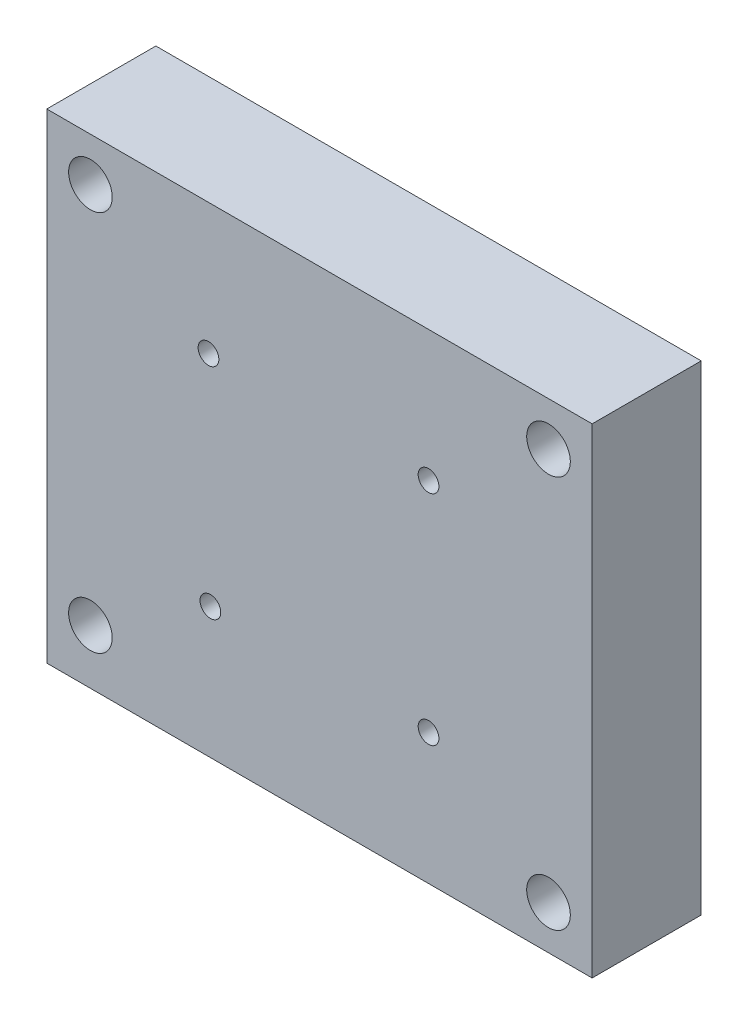
ISO-10303-21;
HEADER;
FILE_DESCRIPTION(('STEP AP214'),'2;1');
FILE_NAME('part.step','',(''),(''),'','','');
FILE_SCHEMA(('AUTOMOTIVE_DESIGN { 1 0 10303 214 1 1 1 1 }'));
ENDSEC;
DATA;
#1=APPLICATION_CONTEXT('core data for automotive mechanical design processes');
#2=APPLICATION_PROTOCOL_DEFINITION('international standard','automotive_design',2000,#1);
#3=PRODUCT_CONTEXT('',#1,'mechanical');
#4=PRODUCT('Part','Part','',(#3));
#5=PRODUCT_RELATED_PRODUCT_CATEGORY('part','',(#4));
#6=PRODUCT_DEFINITION_FORMATION('','',#4);
#7=PRODUCT_DEFINITION_CONTEXT('part definition',#1,'design');
#8=PRODUCT_DEFINITION('design','',#6,#7);
#9=PRODUCT_DEFINITION_SHAPE('','',#8);
#10=(LENGTH_UNIT() NAMED_UNIT(*) SI_UNIT(.MILLI.,.METRE.));
#11=(NAMED_UNIT(*) PLANE_ANGLE_UNIT() SI_UNIT($,.RADIAN.));
#12=(NAMED_UNIT(*) SI_UNIT($,.STERADIAN.) SOLID_ANGLE_UNIT());
#13=UNCERTAINTY_MEASURE_WITH_UNIT(LENGTH_MEASURE(1.E-05),#10,'distance_accuracy_value','');
#14=(GEOMETRIC_REPRESENTATION_CONTEXT(3) GLOBAL_UNCERTAINTY_ASSIGNED_CONTEXT((#13)) GLOBAL_UNIT_ASSIGNED_CONTEXT((#10,
#11,#12)) REPRESENTATION_CONTEXT('',''));
#15=CARTESIAN_POINT('',(0.,0.,0.));
#16=DIRECTION('',(0.,0.,1.));
#17=DIRECTION('',(1.,0.,0.));
#18=AXIS2_PLACEMENT_3D('',#15,#16,#17);
#19=CARTESIAN_POINT('',(25.,-6.,0.));
#20=DIRECTION('',(0.,0.,-1.));
#21=DIRECTION('',(-1.,0.,0.));
#22=AXIS2_PLACEMENT_3D('',#19,#20,#21);
#23=PLANE('',#22);
#24=CARTESIAN_POINT('',(2.,14.,0.));
#25=DIRECTION('',(0.,0.,1.));
#26=DIRECTION('',(1.,0.,0.));
#27=AXIS2_PLACEMENT_3D('',#24,#25,#26);
#28=CIRCLE('',#27,0.999999999999987);
#29=CARTESIAN_POINT('',(2.99999999999999,14.,0.));
#30=VERTEX_POINT('',#29);
#31=EDGE_CURVE('E175',#30,#30,#28,.T.);
#32=ORIENTED_EDGE('',*,*,#31,.F.);
#33=EDGE_LOOP('',(#32));
#34=FACE_BOUND('',#33,.T.);
#35=CARTESIAN_POINT('',(2.,-3.5,0.));
#36=DIRECTION('',(0.,0.,1.));
#37=DIRECTION('',(1.,0.,0.));
#38=AXIS2_PLACEMENT_3D('',#35,#36,#37);
#39=CIRCLE('',#38,0.999999999999987);
#40=CARTESIAN_POINT('',(2.99999999999999,-3.5,0.));
#41=VERTEX_POINT('',#40);
#42=EDGE_CURVE('E169',#41,#41,#39,.T.);
#43=ORIENTED_EDGE('',*,*,#42,.F.);
#44=EDGE_LOOP('',(#43));
#45=FACE_BOUND('',#44,.T.);
#46=CARTESIAN_POINT('',(23.,-4.,0.));
#47=DIRECTION('',(0.,0.,1.));
#48=DIRECTION('',(1.,0.,0.));
#49=AXIS2_PLACEMENT_3D('',#46,#47,#48);
#50=CIRCLE('',#49,0.999999999999987);
#51=CARTESIAN_POINT('',(24.,-4.,0.));
#52=VERTEX_POINT('',#51);
#53=EDGE_CURVE('E163',#52,#52,#50,.T.);
#54=ORIENTED_EDGE('',*,*,#53,.F.);
#55=EDGE_LOOP('',(#54));
#56=FACE_BOUND('',#55,.T.);
#57=CARTESIAN_POINT('',(23.,14.,0.));
#58=DIRECTION('',(0.,0.,1.));
#59=DIRECTION('',(1.,0.,0.));
#60=AXIS2_PLACEMENT_3D('',#57,#58,#59);
#61=CIRCLE('',#60,0.999999999999987);
#62=CARTESIAN_POINT('',(24.,14.,0.));
#63=VERTEX_POINT('',#62);
#64=EDGE_CURVE('E157',#63,#63,#61,.T.);
#65=ORIENTED_EDGE('',*,*,#64,.F.);
#66=EDGE_LOOP('',(#65));
#67=FACE_BOUND('',#66,.T.);
#68=CARTESIAN_POINT('',(17.5,10.,0.));
#69=DIRECTION('',(0.,0.,-1.));
#70=DIRECTION('',(0.,1.,0.));
#71=AXIS2_PLACEMENT_3D('',#68,#69,#70);
#72=CIRCLE('',#71,0.475);
#73=CARTESIAN_POINT('',(17.5,10.475,0.));
#74=VERTEX_POINT('',#73);
#75=EDGE_CURVE('E148',#74,#74,#72,.T.);
#76=ORIENTED_EDGE('',*,*,#75,.T.);
#77=EDGE_LOOP('',(#76));
#78=FACE_BOUND('',#77,.T.);
#79=CARTESIAN_POINT('',(7.41313290791594,10.,0.));
#80=DIRECTION('',(0.,0.,-1.));
#81=DIRECTION('',(0.,1.,0.));
#82=AXIS2_PLACEMENT_3D('',#79,#80,#81);
#83=CIRCLE('',#82,0.475);
#84=CARTESIAN_POINT('',(7.41313290791594,10.475,0.));
#85=VERTEX_POINT('',#84);
#86=EDGE_CURVE('E142',#85,#85,#83,.T.);
#87=ORIENTED_EDGE('',*,*,#86,.T.);
#88=EDGE_LOOP('',(#87));
#89=FACE_BOUND('',#88,.T.);
#90=CARTESIAN_POINT('',(17.5,0.,0.));
#91=DIRECTION('',(0.,0.,-1.));
#92=DIRECTION('',(0.,1.,0.));
#93=AXIS2_PLACEMENT_3D('',#90,#91,#92);
#94=CIRCLE('',#93,0.475);
#95=CARTESIAN_POINT('',(17.5,0.475000000000001,0.));
#96=VERTEX_POINT('',#95);
#97=EDGE_CURVE('E136',#96,#96,#94,.T.);
#98=ORIENTED_EDGE('',*,*,#97,.T.);
#99=EDGE_LOOP('',(#98));
#100=FACE_BOUND('',#99,.T.);
#101=CARTESIAN_POINT('',(7.5,0.,0.));
#102=DIRECTION('',(0.,0.,-1.));
#103=DIRECTION('',(0.,1.,0.));
#104=AXIS2_PLACEMENT_3D('',#101,#102,#103);
#105=CIRCLE('',#104,0.475);
#106=CARTESIAN_POINT('',(7.5,0.475000000000001,0.));
#107=VERTEX_POINT('',#106);
#108=EDGE_CURVE('E130',#107,#107,#105,.T.);
#109=ORIENTED_EDGE('',*,*,#108,.T.);
#110=EDGE_LOOP('',(#109));
#111=FACE_BOUND('',#110,.T.);
#112=DIRECTION('',(0.,-1.,0.));
#113=VECTOR('',#112,1.);
#114=CARTESIAN_POINT('',(0.,-6.,0.));
#115=LINE('',#114,#113);
#116=CARTESIAN_POINT('',(0.,16.,0.));
#117=VERTEX_POINT('',#116);
#118=CARTESIAN_POINT('',(0.,-6.,0.));
#119=VERTEX_POINT('',#118);
#120=EDGE_CURVE('E99',#117,#119,#115,.T.);
#121=ORIENTED_EDGE('',*,*,#120,.T.);
#122=DIRECTION('',(-1.,0.,0.));
#123=VECTOR('',#122,1.);
#124=CARTESIAN_POINT('',(25.,-6.,0.));
#125=LINE('',#124,#123);
#126=CARTESIAN_POINT('',(25.,-6.,0.));
#127=VERTEX_POINT('',#126);
#128=EDGE_CURVE('E11',#127,#119,#125,.T.);
#129=ORIENTED_EDGE('',*,*,#128,.F.);
#130=DIRECTION('',(0.,-1.,0.));
#131=VECTOR('',#130,1.);
#132=CARTESIAN_POINT('',(25.,-6.,0.));
#133=LINE('',#132,#131);
#134=CARTESIAN_POINT('',(25.,16.,0.));
#135=VERTEX_POINT('',#134);
#136=EDGE_CURVE('E87',#135,#127,#133,.T.);
#137=ORIENTED_EDGE('',*,*,#136,.F.);
#138=DIRECTION('',(-1.,0.,0.));
#139=VECTOR('',#138,1.);
#140=CARTESIAN_POINT('',(25.,16.,0.));
#141=LINE('',#140,#139);
#142=EDGE_CURVE('E95',#135,#117,#141,.T.);
#143=ORIENTED_EDGE('',*,*,#142,.T.);
#144=EDGE_LOOP('',(#121,#129,#137,#143));
#145=FACE_BOUND('',#144,.T.);
#146=ADVANCED_FACE('F36',(#34,#45,#56,#67,#78,#89,#100,#111,#145),#23,.F.);
#147=CARTESIAN_POINT('',(25.,-6.,0.));
#148=DIRECTION('',(0.,1.,0.));
#149=DIRECTION('',(0.,0.,1.));
#150=AXIS2_PLACEMENT_3D('',#147,#148,#149);
#151=PLANE('',#150);
#152=CARTESIAN_POINT('',(19.5,-6.,-2.5));
#153=DIRECTION('',(0.,-1.,0.));
#154=DIRECTION('',(0.,0.,-1.));
#155=AXIS2_PLACEMENT_3D('',#152,#153,#154);
#156=CIRCLE('',#155,1.25);
#157=CARTESIAN_POINT('',(19.5,-6.,-3.75));
#158=VERTEX_POINT('',#157);
#159=EDGE_CURVE('E127',#158,#158,#156,.T.);
#160=ORIENTED_EDGE('',*,*,#159,.F.);
#161=EDGE_LOOP('',(#160));
#162=FACE_BOUND('',#161,.T.);
#163=CARTESIAN_POINT('',(12.5,-6.,-2.5));
#164=DIRECTION('',(0.,-1.,0.));
#165=DIRECTION('',(0.,0.,-1.));
#166=AXIS2_PLACEMENT_3D('',#163,#164,#165);
#167=CIRCLE('',#166,1.25);
#168=CARTESIAN_POINT('',(12.5,-6.,-3.75));
#169=VERTEX_POINT('',#168);
#170=EDGE_CURVE('E121',#169,#169,#167,.T.);
#171=ORIENTED_EDGE('',*,*,#170,.F.);
#172=EDGE_LOOP('',(#171));
#173=FACE_BOUND('',#172,.T.);
#174=CARTESIAN_POINT('',(5.5,-6.,-2.5));
#175=DIRECTION('',(0.,-1.,0.));
#176=DIRECTION('',(0.,0.,-1.));
#177=AXIS2_PLACEMENT_3D('',#174,#175,#176);
#178=CIRCLE('',#177,1.25);
#179=CARTESIAN_POINT('',(5.5,-6.,-3.75));
#180=VERTEX_POINT('',#179);
#181=EDGE_CURVE('E115',#180,#180,#178,.T.);
#182=ORIENTED_EDGE('',*,*,#181,.F.);
#183=EDGE_LOOP('',(#182));
#184=FACE_BOUND('',#183,.T.);
#185=DIRECTION('',(0.,0.,-1.));
#186=VECTOR('',#185,1.);
#187=CARTESIAN_POINT('',(0.,-6.,0.));
#188=LINE('',#187,#186);
#189=CARTESIAN_POINT('',(0.,-6.,-5.));
#190=VERTEX_POINT('',#189);
#191=EDGE_CURVE('E91',#119,#190,#188,.T.);
#192=ORIENTED_EDGE('',*,*,#191,.T.);
#193=DIRECTION('',(-1.,0.,0.));
#194=VECTOR('',#193,1.);
#195=CARTESIAN_POINT('',(25.,-6.,-5.));
#196=LINE('',#195,#194);
#197=CARTESIAN_POINT('',(25.,-6.,-5.));
#198=VERTEX_POINT('',#197);
#199=EDGE_CURVE('E44',#198,#190,#196,.T.);
#200=ORIENTED_EDGE('',*,*,#199,.F.);
#201=DIRECTION('',(0.,0.,-1.));
#202=VECTOR('',#201,1.);
#203=CARTESIAN_POINT('',(25.,-6.,0.));
#204=LINE('',#203,#202);
#205=EDGE_CURVE('E82',#127,#198,#204,.T.);
#206=ORIENTED_EDGE('',*,*,#205,.F.);
#207=ORIENTED_EDGE('',*,*,#128,.T.);
#208=EDGE_LOOP('',(#192,#200,#206,#207));
#209=FACE_BOUND('',#208,.T.);
#210=ADVANCED_FACE('F90',(#162,#173,#184,#209),#151,.F.);
#211=CARTESIAN_POINT('',(25.,16.,-5.));
#212=DIRECTION('',(0.,0.,1.));
#213=DIRECTION('',(0.,-1.,0.));
#214=AXIS2_PLACEMENT_3D('',#211,#212,#213);
#215=PLANE('',#214);
#216=CARTESIAN_POINT('',(2.,14.,-5.));
#217=DIRECTION('',(0.,0.,1.));
#218=DIRECTION('',(1.,0.,0.));
#219=AXIS2_PLACEMENT_3D('',#216,#217,#218);
#220=CIRCLE('',#219,0.999999999999999);
#221=CARTESIAN_POINT('',(3.,14.,-5.));
#222=VERTEX_POINT('',#221);
#223=EDGE_CURVE('E172',#222,#222,#220,.T.);
#224=ORIENTED_EDGE('',*,*,#223,.T.);
#225=EDGE_LOOP('',(#224));
#226=FACE_BOUND('',#225,.T.);
#227=CARTESIAN_POINT('',(2.,-3.5,-5.));
#228=DIRECTION('',(0.,0.,1.));
#229=DIRECTION('',(1.,0.,0.));
#230=AXIS2_PLACEMENT_3D('',#227,#228,#229);
#231=CIRCLE('',#230,0.999999999999999);
#232=CARTESIAN_POINT('',(3.,-3.5,-5.));
#233=VERTEX_POINT('',#232);
#234=EDGE_CURVE('E166',#233,#233,#231,.T.);
#235=ORIENTED_EDGE('',*,*,#234,.T.);
#236=EDGE_LOOP('',(#235));
#237=FACE_BOUND('',#236,.T.);
#238=CARTESIAN_POINT('',(23.,-4.,-5.));
#239=DIRECTION('',(0.,0.,1.));
#240=DIRECTION('',(1.,0.,0.));
#241=AXIS2_PLACEMENT_3D('',#238,#239,#240);
#242=CIRCLE('',#241,0.999999999999997);
#243=CARTESIAN_POINT('',(24.,-4.,-5.));
#244=VERTEX_POINT('',#243);
#245=EDGE_CURVE('E160',#244,#244,#242,.T.);
#246=ORIENTED_EDGE('',*,*,#245,.T.);
#247=EDGE_LOOP('',(#246));
#248=FACE_BOUND('',#247,.T.);
#249=CARTESIAN_POINT('',(23.,14.,-5.));
#250=DIRECTION('',(0.,0.,1.));
#251=DIRECTION('',(1.,0.,0.));
#252=AXIS2_PLACEMENT_3D('',#249,#250,#251);
#253=CIRCLE('',#252,0.999999999999997);
#254=CARTESIAN_POINT('',(24.,14.,-5.));
#255=VERTEX_POINT('',#254);
#256=EDGE_CURVE('E154',#255,#255,#253,.T.);
#257=ORIENTED_EDGE('',*,*,#256,.T.);
#258=EDGE_LOOP('',(#257));
#259=FACE_BOUND('',#258,.T.);
#260=CARTESIAN_POINT('',(17.5,10.,-5.));
#261=DIRECTION('',(0.,0.,-1.));
#262=DIRECTION('',(0.,1.,0.));
#263=AXIS2_PLACEMENT_3D('',#260,#261,#262);
#264=CIRCLE('',#263,0.475);
#265=CARTESIAN_POINT('',(17.5,10.475,-5.));
#266=VERTEX_POINT('',#265);
#267=EDGE_CURVE('E151',#266,#266,#264,.T.);
#268=ORIENTED_EDGE('',*,*,#267,.F.);
#269=EDGE_LOOP('',(#268));
#270=FACE_BOUND('',#269,.T.);
#271=CARTESIAN_POINT('',(7.41313290791594,10.,-5.));
#272=DIRECTION('',(0.,0.,-1.));
#273=DIRECTION('',(0.,1.,0.));
#274=AXIS2_PLACEMENT_3D('',#271,#272,#273);
#275=CIRCLE('',#274,0.475);
#276=CARTESIAN_POINT('',(7.41313290791594,10.475,-5.));
#277=VERTEX_POINT('',#276);
#278=EDGE_CURVE('E145',#277,#277,#275,.T.);
#279=ORIENTED_EDGE('',*,*,#278,.F.);
#280=EDGE_LOOP('',(#279));
#281=FACE_BOUND('',#280,.T.);
#282=CARTESIAN_POINT('',(17.5,0.,-5.));
#283=DIRECTION('',(0.,0.,-1.));
#284=DIRECTION('',(0.,1.,0.));
#285=AXIS2_PLACEMENT_3D('',#282,#283,#284);
#286=CIRCLE('',#285,0.475);
#287=CARTESIAN_POINT('',(17.5,0.475000000000001,-5.));
#288=VERTEX_POINT('',#287);
#289=EDGE_CURVE('E139',#288,#288,#286,.T.);
#290=ORIENTED_EDGE('',*,*,#289,.F.);
#291=EDGE_LOOP('',(#290));
#292=FACE_BOUND('',#291,.T.);
#293=CARTESIAN_POINT('',(7.5,0.,-5.));
#294=DIRECTION('',(0.,0.,-1.));
#295=DIRECTION('',(0.,1.,0.));
#296=AXIS2_PLACEMENT_3D('',#293,#294,#295);
#297=CIRCLE('',#296,0.475);
#298=CARTESIAN_POINT('',(7.5,0.475000000000001,-5.));
#299=VERTEX_POINT('',#298);
#300=EDGE_CURVE('E133',#299,#299,#297,.T.);
#301=ORIENTED_EDGE('',*,*,#300,.F.);
#302=EDGE_LOOP('',(#301));
#303=FACE_BOUND('',#302,.T.);
#304=DIRECTION('',(0.,1.,0.));
#305=VECTOR('',#304,1.);
#306=CARTESIAN_POINT('',(0.,16.,-5.));
#307=LINE('',#306,#305);
#308=CARTESIAN_POINT('',(0.,16.,-5.));
#309=VERTEX_POINT('',#308);
#310=EDGE_CURVE('E69',#190,#309,#307,.T.);
#311=ORIENTED_EDGE('',*,*,#310,.T.);
#312=DIRECTION('',(-1.,0.,0.));
#313=VECTOR('',#312,1.);
#314=CARTESIAN_POINT('',(25.,16.,-5.));
#315=LINE('',#314,#313);
#316=CARTESIAN_POINT('',(25.,16.,-5.));
#317=VERTEX_POINT('',#316);
#318=EDGE_CURVE('E92',#317,#309,#315,.T.);
#319=ORIENTED_EDGE('',*,*,#318,.F.);
#320=DIRECTION('',(0.,1.,0.));
#321=VECTOR('',#320,1.);
#322=CARTESIAN_POINT('',(25.,16.,-5.));
#323=LINE('',#322,#321);
#324=EDGE_CURVE('E85',#198,#317,#323,.T.);
#325=ORIENTED_EDGE('',*,*,#324,.F.);
#326=ORIENTED_EDGE('',*,*,#199,.T.);
#327=EDGE_LOOP('',(#311,#319,#325,#326));
#328=FACE_BOUND('',#327,.T.);
#329=ADVANCED_FACE('F93',(#226,#237,#248,#259,#270,#281,#292,#303,#328),#215,.F.);
#330=CARTESIAN_POINT('',(25.,16.,0.));
#331=DIRECTION('',(0.,-1.,0.));
#332=DIRECTION('',(0.,0.,-1.));
#333=AXIS2_PLACEMENT_3D('',#330,#331,#332);
#334=PLANE('',#333);
#335=DIRECTION('',(0.,0.,1.));
#336=VECTOR('',#335,1.);
#337=CARTESIAN_POINT('',(0.,16.,0.));
#338=LINE('',#337,#336);
#339=EDGE_CURVE('E75',#309,#117,#338,.T.);
#340=ORIENTED_EDGE('',*,*,#339,.T.);
#341=ORIENTED_EDGE('',*,*,#142,.F.);
#342=DIRECTION('',(0.,0.,1.));
#343=VECTOR('',#342,1.);
#344=CARTESIAN_POINT('',(25.,16.,0.));
#345=LINE('',#344,#343);
#346=EDGE_CURVE('E52',#317,#135,#345,.T.);
#347=ORIENTED_EDGE('',*,*,#346,.F.);
#348=ORIENTED_EDGE('',*,*,#318,.T.);
#349=EDGE_LOOP('',(#340,#341,#347,#348));
#350=FACE_BOUND('',#349,.T.);
#351=ADVANCED_FACE('F107',(#350),#334,.F.);
#352=CARTESIAN_POINT('',(25.,0.,0.));
#353=DIRECTION('',(-1.,0.,0.));
#354=DIRECTION('',(0.,0.,1.));
#355=AXIS2_PLACEMENT_3D('',#352,#353,#354);
#356=PLANE('',#355);
#357=ORIENTED_EDGE('',*,*,#136,.T.);
#358=ORIENTED_EDGE('',*,*,#205,.T.);
#359=ORIENTED_EDGE('',*,*,#324,.T.);
#360=ORIENTED_EDGE('',*,*,#346,.T.);
#361=EDGE_LOOP('',(#357,#358,#359,#360));
#362=FACE_BOUND('',#361,.T.);
#363=ADVANCED_FACE('F83',(#362),#356,.F.);
#364=CARTESIAN_POINT('',(0.,0.,0.));
#365=DIRECTION('',(-1.,0.,0.));
#366=DIRECTION('',(0.,0.,1.));
#367=AXIS2_PLACEMENT_3D('',#364,#365,#366);
#368=PLANE('',#367);
#369=ORIENTED_EDGE('',*,*,#120,.F.);
#370=ORIENTED_EDGE('',*,*,#339,.F.);
#371=ORIENTED_EDGE('',*,*,#310,.F.);
#372=ORIENTED_EDGE('',*,*,#191,.F.);
#373=EDGE_LOOP('',(#369,#370,#371,#372));
#374=FACE_BOUND('',#373,.T.);
#375=ADVANCED_FACE('F110',(#374),#368,.T.);
#376=CARTESIAN_POINT('',(5.5,-0.999999999999999,-2.5));
#377=DIRECTION('',(0.,1.,0.));
#378=DIRECTION('',(0.,0.,1.));
#379=AXIS2_PLACEMENT_3D('',#376,#377,#378);
#380=PLANE('',#379);
#381=CARTESIAN_POINT('',(5.5,-0.999999999999998,-2.5));
#382=DIRECTION('',(0.,-1.,0.));
#383=DIRECTION('',(0.,0.,-1.));
#384=AXIS2_PLACEMENT_3D('',#381,#382,#383);
#385=CIRCLE('',#384,1.25);
#386=CARTESIAN_POINT('',(5.5,-0.999999999999998,-3.75));
#387=VERTEX_POINT('',#386);
#388=EDGE_CURVE('E102',#387,#387,#385,.T.);
#389=ORIENTED_EDGE('',*,*,#388,.T.);
#390=EDGE_LOOP('',(#389));
#391=FACE_BOUND('',#390,.T.);
#392=ADVANCED_FACE('F218',(#391),#380,.F.);
#393=CARTESIAN_POINT('',(5.5,-6.,-2.5));
#394=DIRECTION('',(0.,-1.,0.));
#395=DIRECTION('',(0.,0.,-1.));
#396=AXIS2_PLACEMENT_3D('',#393,#394,#395);
#397=CYLINDRICAL_SURFACE('',#396,1.25);
#398=ORIENTED_EDGE('',*,*,#388,.F.);
#399=EDGE_LOOP('',(#398));
#400=FACE_BOUND('',#399,.T.);
#401=ORIENTED_EDGE('',*,*,#181,.T.);
#402=EDGE_LOOP('',(#401));
#403=FACE_BOUND('',#402,.T.);
#404=ADVANCED_FACE('F223',(#400,#403),#397,.F.);
#405=CARTESIAN_POINT('',(12.5,-0.999999999999999,-2.5));
#406=DIRECTION('',(0.,1.,0.));
#407=DIRECTION('',(0.,0.,1.));
#408=AXIS2_PLACEMENT_3D('',#405,#406,#407);
#409=PLANE('',#408);
#410=CARTESIAN_POINT('',(12.5,-0.999999999999998,-2.5));
#411=DIRECTION('',(0.,-1.,0.));
#412=DIRECTION('',(0.,0.,-1.));
#413=AXIS2_PLACEMENT_3D('',#410,#411,#412);
#414=CIRCLE('',#413,1.25);
#415=CARTESIAN_POINT('',(12.5,-0.999999999999998,-3.75));
#416=VERTEX_POINT('',#415);
#417=EDGE_CURVE('E118',#416,#416,#414,.T.);
#418=ORIENTED_EDGE('',*,*,#417,.T.);
#419=EDGE_LOOP('',(#418));
#420=FACE_BOUND('',#419,.T.);
#421=ADVANCED_FACE('F227',(#420),#409,.F.);
#422=CARTESIAN_POINT('',(12.5,-6.,-2.5));
#423=DIRECTION('',(0.,-1.,0.));
#424=DIRECTION('',(0.,0.,-1.));
#425=AXIS2_PLACEMENT_3D('',#422,#423,#424);
#426=CYLINDRICAL_SURFACE('',#425,1.25);
#427=ORIENTED_EDGE('',*,*,#417,.F.);
#428=EDGE_LOOP('',(#427));
#429=FACE_BOUND('',#428,.T.);
#430=ORIENTED_EDGE('',*,*,#170,.T.);
#431=EDGE_LOOP('',(#430));
#432=FACE_BOUND('',#431,.T.);
#433=ADVANCED_FACE('F231',(#429,#432),#426,.F.);
#434=CARTESIAN_POINT('',(19.5,-0.999999999999999,-2.5));
#435=DIRECTION('',(0.,1.,0.));
#436=DIRECTION('',(0.,0.,1.));
#437=AXIS2_PLACEMENT_3D('',#434,#435,#436);
#438=PLANE('',#437);
#439=CARTESIAN_POINT('',(19.5,-0.999999999999998,-2.5));
#440=DIRECTION('',(0.,-1.,0.));
#441=DIRECTION('',(0.,0.,-1.));
#442=AXIS2_PLACEMENT_3D('',#439,#440,#441);
#443=CIRCLE('',#442,1.25);
#444=CARTESIAN_POINT('',(19.5,-0.999999999999998,-3.75));
#445=VERTEX_POINT('',#444);
#446=EDGE_CURVE('E124',#445,#445,#443,.T.);
#447=ORIENTED_EDGE('',*,*,#446,.T.);
#448=EDGE_LOOP('',(#447));
#449=FACE_BOUND('',#448,.T.);
#450=ADVANCED_FACE('F235',(#449),#438,.F.);
#451=CARTESIAN_POINT('',(19.5,-6.,-2.5));
#452=DIRECTION('',(0.,-1.,0.));
#453=DIRECTION('',(0.,0.,-1.));
#454=AXIS2_PLACEMENT_3D('',#451,#452,#453);
#455=CYLINDRICAL_SURFACE('',#454,1.25);
#456=ORIENTED_EDGE('',*,*,#446,.F.);
#457=EDGE_LOOP('',(#456));
#458=FACE_BOUND('',#457,.T.);
#459=ORIENTED_EDGE('',*,*,#159,.T.);
#460=EDGE_LOOP('',(#459));
#461=FACE_BOUND('',#460,.T.);
#462=ADVANCED_FACE('F201',(#458,#461),#455,.F.);
#463=CARTESIAN_POINT('',(7.5,0.,-5.));
#464=DIRECTION('',(0.,0.,-1.));
#465=DIRECTION('',(0.,1.,0.));
#466=AXIS2_PLACEMENT_3D('',#463,#464,#465);
#467=CYLINDRICAL_SURFACE('',#466,0.475);
#468=ORIENTED_EDGE('',*,*,#108,.F.);
#469=EDGE_LOOP('',(#468));
#470=FACE_BOUND('',#469,.T.);
#471=ORIENTED_EDGE('',*,*,#300,.T.);
#472=EDGE_LOOP('',(#471));
#473=FACE_BOUND('',#472,.T.);
#474=ADVANCED_FACE('F197',(#470,#473),#467,.F.);
#475=CARTESIAN_POINT('',(17.5,0.,-5.));
#476=DIRECTION('',(0.,0.,-1.));
#477=DIRECTION('',(0.,1.,0.));
#478=AXIS2_PLACEMENT_3D('',#475,#476,#477);
#479=CYLINDRICAL_SURFACE('',#478,0.475);
#480=ORIENTED_EDGE('',*,*,#97,.F.);
#481=EDGE_LOOP('',(#480));
#482=FACE_BOUND('',#481,.T.);
#483=ORIENTED_EDGE('',*,*,#289,.T.);
#484=EDGE_LOOP('',(#483));
#485=FACE_BOUND('',#484,.T.);
#486=ADVANCED_FACE('F200',(#482,#485),#479,.F.);
#487=CARTESIAN_POINT('',(7.41313290791594,10.,-5.));
#488=DIRECTION('',(0.,0.,-1.));
#489=DIRECTION('',(0.,1.,0.));
#490=AXIS2_PLACEMENT_3D('',#487,#488,#489);
#491=CYLINDRICAL_SURFACE('',#490,0.475);
#492=ORIENTED_EDGE('',*,*,#86,.F.);
#493=EDGE_LOOP('',(#492));
#494=FACE_BOUND('',#493,.T.);
#495=ORIENTED_EDGE('',*,*,#278,.T.);
#496=EDGE_LOOP('',(#495));
#497=FACE_BOUND('',#496,.T.);
#498=ADVANCED_FACE('F245',(#494,#497),#491,.F.);
#499=CARTESIAN_POINT('',(17.5,10.,-5.));
#500=DIRECTION('',(0.,0.,-1.));
#501=DIRECTION('',(0.,1.,0.));
#502=AXIS2_PLACEMENT_3D('',#499,#500,#501);
#503=CYLINDRICAL_SURFACE('',#502,0.475);
#504=ORIENTED_EDGE('',*,*,#75,.F.);
#505=EDGE_LOOP('',(#504));
#506=FACE_BOUND('',#505,.T.);
#507=ORIENTED_EDGE('',*,*,#267,.T.);
#508=EDGE_LOOP('',(#507));
#509=FACE_BOUND('',#508,.T.);
#510=ADVANCED_FACE('F249',(#506,#509),#503,.F.);
#511=CARTESIAN_POINT('',(23.,14.,0.));
#512=DIRECTION('',(0.,0.,1.));
#513=DIRECTION('',(1.,0.,0.));
#514=AXIS2_PLACEMENT_3D('',#511,#512,#513);
#515=CYLINDRICAL_SURFACE('',#514,0.999999999999992);
#516=ORIENTED_EDGE('',*,*,#256,.F.);
#517=EDGE_LOOP('',(#516));
#518=FACE_BOUND('',#517,.T.);
#519=ORIENTED_EDGE('',*,*,#64,.T.);
#520=EDGE_LOOP('',(#519));
#521=FACE_BOUND('',#520,.T.);
#522=ADVANCED_FACE('F253',(#518,#521),#515,.F.);
#523=CARTESIAN_POINT('',(23.,-4.,0.));
#524=DIRECTION('',(0.,0.,1.));
#525=DIRECTION('',(1.,0.,0.));
#526=AXIS2_PLACEMENT_3D('',#523,#524,#525);
#527=CYLINDRICAL_SURFACE('',#526,0.999999999999992);
#528=ORIENTED_EDGE('',*,*,#245,.F.);
#529=EDGE_LOOP('',(#528));
#530=FACE_BOUND('',#529,.T.);
#531=ORIENTED_EDGE('',*,*,#53,.T.);
#532=EDGE_LOOP('',(#531));
#533=FACE_BOUND('',#532,.T.);
#534=ADVANCED_FACE('F257',(#530,#533),#527,.F.);
#535=CARTESIAN_POINT('',(2.,-3.5,0.));
#536=DIRECTION('',(0.,0.,1.));
#537=DIRECTION('',(1.,0.,0.));
#538=AXIS2_PLACEMENT_3D('',#535,#536,#537);
#539=CYLINDRICAL_SURFACE('',#538,0.999999999999993);
#540=ORIENTED_EDGE('',*,*,#234,.F.);
#541=EDGE_LOOP('',(#540));
#542=FACE_BOUND('',#541,.T.);
#543=ORIENTED_EDGE('',*,*,#42,.T.);
#544=EDGE_LOOP('',(#543));
#545=FACE_BOUND('',#544,.T.);
#546=ADVANCED_FACE('F261',(#542,#545),#539,.F.);
#547=CARTESIAN_POINT('',(2.,14.,0.));
#548=DIRECTION('',(0.,0.,1.));
#549=DIRECTION('',(1.,0.,0.));
#550=AXIS2_PLACEMENT_3D('',#547,#548,#549);
#551=CYLINDRICAL_SURFACE('',#550,0.999999999999993);
#552=ORIENTED_EDGE('',*,*,#223,.F.);
#553=EDGE_LOOP('',(#552));
#554=FACE_BOUND('',#553,.T.);
#555=ORIENTED_EDGE('',*,*,#31,.T.);
#556=EDGE_LOOP('',(#555));
#557=FACE_BOUND('',#556,.T.);
#558=ADVANCED_FACE('F179',(#554,#557),#551,.F.);
#559=CLOSED_SHELL('',(#146,#210,#329,#351,#363,#375,#392,#404,#421,#433,#450,#462,#474,#486,
#498,#510,#522,#534,#546,#558));
#560=MANIFOLD_SOLID_BREP('B2',#559);
#561=ADVANCED_BREP_SHAPE_REPRESENTATION('',(#18,#560),#14);
#562=SHAPE_DEFINITION_REPRESENTATION(#9,#561);
ENDSEC;
END-ISO-10303-21;
